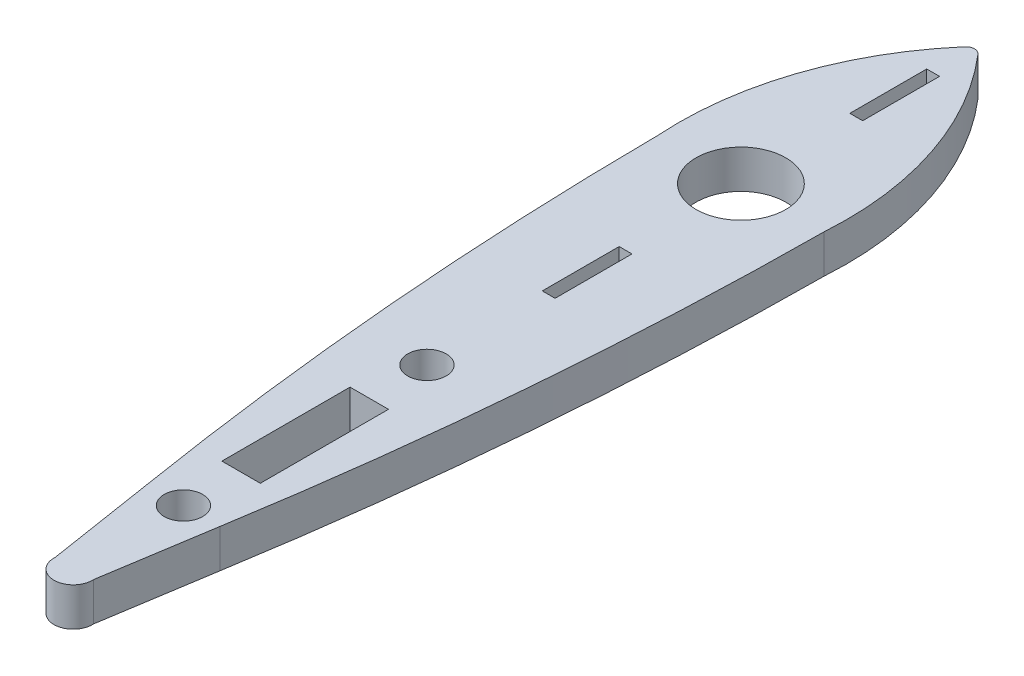
ISO-10303-21;
HEADER;
FILE_DESCRIPTION(('STEP AP214'),'2;1');
FILE_NAME('part.step','',(''),(''),'','','');
FILE_SCHEMA(('AUTOMOTIVE_DESIGN { 1 0 10303 214 1 1 1 1 }'));
ENDSEC;
DATA;
#1=APPLICATION_CONTEXT('core data for automotive mechanical design processes');
#2=APPLICATION_PROTOCOL_DEFINITION('international standard','automotive_design',2000,#1);
#3=PRODUCT_CONTEXT('',#1,'mechanical');
#4=PRODUCT('Part','Part','',(#3));
#5=PRODUCT_RELATED_PRODUCT_CATEGORY('part','',(#4));
#6=PRODUCT_DEFINITION_FORMATION('','',#4);
#7=PRODUCT_DEFINITION_CONTEXT('part definition',#1,'design');
#8=PRODUCT_DEFINITION('design','',#6,#7);
#9=PRODUCT_DEFINITION_SHAPE('','',#8);
#10=(LENGTH_UNIT() NAMED_UNIT(*) SI_UNIT(.MILLI.,.METRE.));
#11=(NAMED_UNIT(*) PLANE_ANGLE_UNIT() SI_UNIT($,.RADIAN.));
#12=(NAMED_UNIT(*) SI_UNIT($,.STERADIAN.) SOLID_ANGLE_UNIT());
#13=UNCERTAINTY_MEASURE_WITH_UNIT(LENGTH_MEASURE(1.E-05),#10,'distance_accuracy_value','');
#14=(GEOMETRIC_REPRESENTATION_CONTEXT(3) GLOBAL_UNCERTAINTY_ASSIGNED_CONTEXT((#13)) GLOBAL_UNIT_ASSIGNED_CONTEXT((#10,
#11,#12)) REPRESENTATION_CONTEXT('',''));
#15=CARTESIAN_POINT('',(0.,0.,0.));
#16=DIRECTION('',(0.,0.,1.));
#17=DIRECTION('',(1.,0.,0.));
#18=AXIS2_PLACEMENT_3D('',#15,#16,#17);
#19=CARTESIAN_POINT('',(275.41775236671,3.,-1.94905536330217));
#20=DIRECTION('',(0.,-1.,0.));
#21=DIRECTION('',(0.,0.,-1.));
#22=AXIS2_PLACEMENT_3D('',#19,#20,#21);
#23=PLANE('',#22);
#24=CARTESIAN_POINT('',(-0.0431181659658649,3.,24.377133974683));
#25=DIRECTION('',(0.,1.,0.));
#26=DIRECTION('',(0.,0.,1.));
#27=AXIS2_PLACEMENT_3D('',#24,#25,#26);
#28=CIRCLE('',#27,1.5);
#29=CARTESIAN_POINT('',(-0.0431181659658649,3.,25.877133974683));
#30=VERTEX_POINT('',#29);
#31=EDGE_CURVE('E206',#30,#30,#28,.T.);
#32=ORIENTED_EDGE('',*,*,#31,.F.);
#33=EDGE_LOOP('',(#32));
#34=FACE_BOUND('',#33,.T.);
#35=CARTESIAN_POINT('',(-0.043118165965858,3.,43.377133974683));
#36=DIRECTION('',(0.,1.,0.));
#37=DIRECTION('',(0.,0.,1.));
#38=AXIS2_PLACEMENT_3D('',#35,#36,#37);
#39=CIRCLE('',#38,1.5);
#40=CARTESIAN_POINT('',(-0.043118165965858,3.,44.877133974683));
#41=VERTEX_POINT('',#40);
#42=EDGE_CURVE('E212',#41,#41,#39,.T.);
#43=ORIENTED_EDGE('',*,*,#42,.F.);
#44=EDGE_LOOP('',(#43));
#45=FACE_BOUND('',#44,.T.);
#46=DIRECTION('',(0.,0.,-1.));
#47=VECTOR('',#46,1.);
#48=CARTESIAN_POINT('',(0.456881834034132,3.,-9.12286602531705));
#49=LINE('',#48,#47);
#50=CARTESIAN_POINT('',(0.456881834034132,3.,-9.12286602531705));
#51=VERTEX_POINT('',#50);
#52=CARTESIAN_POINT('',(0.456881834034132,3.,-15.122866025317));
#53=VERTEX_POINT('',#52);
#54=EDGE_CURVE('E218',#51,#53,#49,.T.);
#55=ORIENTED_EDGE('',*,*,#54,.F.);
#56=DIRECTION('',(1.,0.,0.));
#57=VECTOR('',#56,1.);
#58=CARTESIAN_POINT('',(-0.543118165965867,3.,-9.12286602531705));
#59=LINE('',#58,#57);
#60=CARTESIAN_POINT('',(-0.543118165965917,3.,-9.12286602531705));
#61=VERTEX_POINT('',#60);
#62=EDGE_CURVE('E226',#61,#51,#59,.T.);
#63=ORIENTED_EDGE('',*,*,#62,.F.);
#64=DIRECTION('',(0.,0.,1.));
#65=VECTOR('',#64,1.);
#66=CARTESIAN_POINT('',(-0.543118165965867,3.,-15.122866025317));
#67=LINE('',#66,#65);
#68=CARTESIAN_POINT('',(-0.543118165965867,3.,-15.122866025317));
#69=VERTEX_POINT('',#68);
#70=EDGE_CURVE('E223',#69,#61,#67,.T.);
#71=ORIENTED_EDGE('',*,*,#70,.F.);
#72=DIRECTION('',(-1.,0.,0.));
#73=VECTOR('',#72,1.);
#74=CARTESIAN_POINT('',(0.456881834034132,3.,-15.122866025317));
#75=LINE('',#74,#73);
#76=EDGE_CURVE('E220',#53,#69,#75,.T.);
#77=ORIENTED_EDGE('',*,*,#76,.F.);
#78=EDGE_LOOP('',(#55,#63,#71,#77));
#79=FACE_BOUND('',#78,.T.);
#80=CARTESIAN_POINT('',(-0.0431181659658678,3.,-0.122866025317046));
#81=DIRECTION('',(0.,1.,0.));
#82=DIRECTION('',(0.,0.,1.));
#83=AXIS2_PLACEMENT_3D('',#80,#81,#82);
#84=CIRCLE('',#83,3.5);
#85=CARTESIAN_POINT('',(-0.0431181659658678,3.,3.37713397468295));
#86=VERTEX_POINT('',#85);
#87=EDGE_CURVE('E281',#86,#86,#84,.T.);
#88=ORIENTED_EDGE('',*,*,#87,.F.);
#89=EDGE_LOOP('',(#88));
#90=FACE_BOUND('',#89,.T.);
#91=CARTESIAN_POINT('',(275.41775236671,3.,-1.94905536330217));
#92=DIRECTION('',(0.,1.,0.));
#93=DIRECTION('',(0.,0.,-1.));
#94=AXIS2_PLACEMENT_3D('',#91,#92,#93);
#95=CIRCLE('',#94,281.96678435419);
#96=CARTESIAN_POINT('',(-6.54311816596587,3.,-0.122866025317048));
#97=VERTEX_POINT('',#96);
#98=CARTESIAN_POINT('',(-2.88209319404319,3.,43.3771339746829));
#99=VERTEX_POINT('',#98);
#100=EDGE_CURVE('E287',#97,#99,#95,.T.);
#101=ORIENTED_EDGE('',*,*,#100,.T.);
#102=DIRECTION('',(0.155607634918458,0.,0.987818942901524));
#103=VECTOR('',#102,1.);
#104=CARTESIAN_POINT('',(-1.54311816596586,3.,51.877133974683));
#105=LINE('',#104,#103);
#106=CARTESIAN_POINT('',(-1.54311816596586,3.,51.877133974683));
#107=VERTEX_POINT('',#106);
#108=EDGE_CURVE('E290',#99,#107,#105,.T.);
#109=ORIENTED_EDGE('',*,*,#108,.T.);
#110=CARTESIAN_POINT('',(-0.043118165965858,3.,51.9758627499524));
#111=DIRECTION('',(0.,1.,0.));
#112=DIRECTION('',(0.,0.,1.));
#113=AXIS2_PLACEMENT_3D('',#110,#111,#112);
#114=CIRCLE('',#113,1.50324561235554);
#115=CARTESIAN_POINT('',(1.45688183403414,3.,51.877133974683));
#116=VERTEX_POINT('',#115);
#117=EDGE_CURVE('E293',#107,#116,#114,.T.);
#118=ORIENTED_EDGE('',*,*,#117,.T.);
#119=DIRECTION('',(0.155607634918589,0.,-0.987818942901503));
#120=VECTOR('',#119,1.);
#121=CARTESIAN_POINT('',(1.45688183403414,3.,51.877133974683));
#122=LINE('',#121,#120);
#123=CARTESIAN_POINT('',(2.79585686211259,3.,43.3771339746829));
#124=VERTEX_POINT('',#123);
#125=EDGE_CURVE('E295',#116,#124,#122,.T.);
#126=ORIENTED_EDGE('',*,*,#125,.T.);
#127=CARTESIAN_POINT('',(-275.503988698641,3.,-1.94905536330217));
#128=DIRECTION('',(0.,1.,0.));
#129=DIRECTION('',(0.,0.,1.));
#130=AXIS2_PLACEMENT_3D('',#127,#128,#129);
#131=CIRCLE('',#130,281.96678435419);
#132=CARTESIAN_POINT('',(6.45688183403413,3.,-0.122866025317046));
#133=VERTEX_POINT('',#132);
#134=EDGE_CURVE('E297',#124,#133,#131,.T.);
#135=ORIENTED_EDGE('',*,*,#134,.T.);
#136=CARTESIAN_POINT('',(-18.416155285819,3.,-1.83185365203266));
#137=DIRECTION('',(0.,1.,0.));
#138=DIRECTION('',(0.,0.,1.));
#139=AXIS2_PLACEMENT_3D('',#136,#137,#138);
#140=CIRCLE('',#139,24.9316789301054);
#141=CARTESIAN_POINT('',(0.456881834034132,3.,-18.122866025317));
#142=VERTEX_POINT('',#141);
#143=EDGE_CURVE('E299',#133,#142,#140,.T.);
#144=ORIENTED_EDGE('',*,*,#143,.T.);
#145=CARTESIAN_POINT('',(-0.0431181659658678,3.,-17.6743779736352));
#146=DIRECTION('',(0.,1.,0.));
#147=DIRECTION('',(0.,0.,-1.));
#148=AXIS2_PLACEMENT_3D('',#145,#146,#147);
#149=CIRCLE('',#148,0.671670702428921);
#150=CARTESIAN_POINT('',(-0.543118165965875,3.,-18.122866025317));
#151=VERTEX_POINT('',#150);
#152=EDGE_CURVE('E301',#142,#151,#149,.T.);
#153=ORIENTED_EDGE('',*,*,#152,.T.);
#154=CARTESIAN_POINT('',(18.3299189538873,3.,-1.83185365203266));
#155=DIRECTION('',(0.,1.,0.));
#156=DIRECTION('',(0.,0.,-1.));
#157=AXIS2_PLACEMENT_3D('',#154,#155,#156);
#158=CIRCLE('',#157,24.9316789301054);
#159=EDGE_CURVE('E303',#151,#97,#158,.T.);
#160=ORIENTED_EDGE('',*,*,#159,.T.);
#161=EDGE_LOOP('',(#101,#109,#118,#126,#135,#144,#153,#160));
#162=FACE_BOUND('',#161,.T.);
#163=DIRECTION('',(-1.,0.,0.));
#164=VECTOR('',#163,1.);
#165=CARTESIAN_POINT('',(-0.543118165965867,3.,8.87713397468295));
#166=LINE('',#165,#164);
#167=CARTESIAN_POINT('',(0.456881834034132,3.,8.87713397468295));
#168=VERTEX_POINT('',#167);
#169=CARTESIAN_POINT('',(-0.543118165965867,3.,8.87713397468295));
#170=VERTEX_POINT('',#169);
#171=EDGE_CURVE('E249',#168,#170,#166,.T.);
#172=ORIENTED_EDGE('',*,*,#171,.F.);
#173=DIRECTION('',(0.,0.,-1.));
#174=VECTOR('',#173,1.);
#175=CARTESIAN_POINT('',(0.456881834034132,3.,8.87713397468295));
#176=LINE('',#175,#174);
#177=CARTESIAN_POINT('',(0.45688183403414,3.,14.877133974683));
#178=VERTEX_POINT('',#177);
#179=EDGE_CURVE('E257',#178,#168,#176,.T.);
#180=ORIENTED_EDGE('',*,*,#179,.F.);
#181=DIRECTION('',(1.,0.,0.));
#182=VECTOR('',#181,1.);
#183=CARTESIAN_POINT('',(-0.0431181659658659,3.,14.877133974683));
#184=LINE('',#183,#182);
#185=CARTESIAN_POINT('',(-0.543118165965867,3.,14.877133974683));
#186=VERTEX_POINT('',#185);
#187=EDGE_CURVE('E254',#186,#178,#184,.T.);
#188=ORIENTED_EDGE('',*,*,#187,.F.);
#189=DIRECTION('',(0.,0.,1.));
#190=VECTOR('',#189,1.);
#191=CARTESIAN_POINT('',(-0.543118165965867,3.,14.877133974683));
#192=LINE('',#191,#190);
#193=EDGE_CURVE('E251',#170,#186,#192,.T.);
#194=ORIENTED_EDGE('',*,*,#193,.F.);
#195=EDGE_LOOP('',(#172,#180,#188,#194));
#196=FACE_BOUND('',#195,.T.);
#197=DIRECTION('',(1.,0.,0.));
#198=VECTOR('',#197,1.);
#199=CARTESIAN_POINT('',(-1.54311816596586,3.,38.877133974683));
#200=LINE('',#199,#198);
#201=CARTESIAN_POINT('',(-1.54311816596586,3.,38.877133974683));
#202=VERTEX_POINT('',#201);
#203=CARTESIAN_POINT('',(1.45688183403414,3.,38.877133974683));
#204=VERTEX_POINT('',#203);
#205=EDGE_CURVE('E167',#202,#204,#200,.T.);
#206=ORIENTED_EDGE('',*,*,#205,.F.);
#207=DIRECTION('',(0.,0.,1.));
#208=VECTOR('',#207,1.);
#209=CARTESIAN_POINT('',(-1.54311816596586,3.,28.877133974683));
#210=LINE('',#209,#208);
#211=CARTESIAN_POINT('',(-1.54311816596586,3.,28.877133974683));
#212=VERTEX_POINT('',#211);
#213=EDGE_CURVE('E191',#212,#202,#210,.T.);
#214=ORIENTED_EDGE('',*,*,#213,.F.);
#215=DIRECTION('',(-1.,0.,0.));
#216=VECTOR('',#215,1.);
#217=CARTESIAN_POINT('',(-0.043118165965858,3.,28.877133974683));
#218=LINE('',#217,#216);
#219=CARTESIAN_POINT('',(1.45688183403414,3.,28.877133974683));
#220=VERTEX_POINT('',#219);
#221=EDGE_CURVE('E189',#220,#212,#218,.T.);
#222=ORIENTED_EDGE('',*,*,#221,.F.);
#223=DIRECTION('',(0.,0.,-1.));
#224=VECTOR('',#223,1.);
#225=CARTESIAN_POINT('',(1.45688183403414,3.,28.877133974683));
#226=LINE('',#225,#224);
#227=EDGE_CURVE('E175',#204,#220,#226,.T.);
#228=ORIENTED_EDGE('',*,*,#227,.F.);
#229=EDGE_LOOP('',(#206,#214,#222,#228));
#230=FACE_BOUND('',#229,.T.);
#231=ADVANCED_FACE('F32',(#34,#45,#79,#90,#162,#196,#230),#23,.F.);
#232=CARTESIAN_POINT('',(275.41775236671,0.,-1.94905536330217));
#233=DIRECTION('',(0.,-1.,0.));
#234=DIRECTION('',(0.,0.,-1.));
#235=AXIS2_PLACEMENT_3D('',#232,#233,#234);
#236=PLANE('',#235);
#237=CARTESIAN_POINT('',(-0.043118165965858,0.,43.377133974683));
#238=DIRECTION('',(0.,1.,0.));
#239=DIRECTION('',(0.,0.,1.));
#240=AXIS2_PLACEMENT_3D('',#237,#238,#239);
#241=CIRCLE('',#240,1.5);
#242=CARTESIAN_POINT('',(-0.043118165965858,0.,44.877133974683));
#243=VERTEX_POINT('',#242);
#244=EDGE_CURVE('E209',#243,#243,#241,.T.);
#245=ORIENTED_EDGE('',*,*,#244,.T.);
#246=EDGE_LOOP('',(#245));
#247=FACE_BOUND('',#246,.T.);
#248=CARTESIAN_POINT('',(275.41775236671,0.,-1.94905536330217));
#249=DIRECTION('',(0.,1.,0.));
#250=DIRECTION('',(0.,0.,-1.));
#251=AXIS2_PLACEMENT_3D('',#248,#249,#250);
#252=CIRCLE('',#251,281.96678435419);
#253=CARTESIAN_POINT('',(-6.54311816596587,0.,-0.122866025317048));
#254=VERTEX_POINT('',#253);
#255=CARTESIAN_POINT('',(-2.88209319404319,0.,43.3771339746829));
#256=VERTEX_POINT('',#255);
#257=EDGE_CURVE('E284',#254,#256,#252,.T.);
#258=ORIENTED_EDGE('',*,*,#257,.F.);
#259=CARTESIAN_POINT('',(18.3299189538873,0.,-1.83185365203266));
#260=DIRECTION('',(0.,1.,0.));
#261=DIRECTION('',(0.,0.,-1.));
#262=AXIS2_PLACEMENT_3D('',#259,#260,#261);
#263=CIRCLE('',#262,24.9316789301054);
#264=CARTESIAN_POINT('',(-0.543118165965875,0.,-18.122866025317));
#265=VERTEX_POINT('',#264);
#266=EDGE_CURVE('E291',#265,#254,#263,.T.);
#267=ORIENTED_EDGE('',*,*,#266,.F.);
#268=CARTESIAN_POINT('',(-0.0431181659658678,0.,-17.6743779736352));
#269=DIRECTION('',(0.,1.,0.));
#270=DIRECTION('',(0.,0.,-1.));
#271=AXIS2_PLACEMENT_3D('',#268,#269,#270);
#272=CIRCLE('',#271,0.671670702428921);
#273=CARTESIAN_POINT('',(0.456881834034132,0.,-18.122866025317));
#274=VERTEX_POINT('',#273);
#275=EDGE_CURVE('E318',#274,#265,#272,.T.);
#276=ORIENTED_EDGE('',*,*,#275,.F.);
#277=CARTESIAN_POINT('',(-18.416155285819,0.,-1.83185365203266));
#278=DIRECTION('',(0.,1.,0.));
#279=DIRECTION('',(0.,0.,1.));
#280=AXIS2_PLACEMENT_3D('',#277,#278,#279);
#281=CIRCLE('',#280,24.9316789301054);
#282=CARTESIAN_POINT('',(6.45688183403413,0.,-0.122866025317046));
#283=VERTEX_POINT('',#282);
#284=EDGE_CURVE('E316',#283,#274,#281,.T.);
#285=ORIENTED_EDGE('',*,*,#284,.F.);
#286=CARTESIAN_POINT('',(-275.503988698641,0.,-1.94905536330217));
#287=DIRECTION('',(0.,1.,0.));
#288=DIRECTION('',(0.,0.,1.));
#289=AXIS2_PLACEMENT_3D('',#286,#287,#288);
#290=CIRCLE('',#289,281.96678435419);
#291=CARTESIAN_POINT('',(2.79585686211259,0.,43.3771339746829));
#292=VERTEX_POINT('',#291);
#293=EDGE_CURVE('E314',#292,#283,#290,.T.);
#294=ORIENTED_EDGE('',*,*,#293,.F.);
#295=DIRECTION('',(0.155607634918589,0.,-0.987818942901503));
#296=VECTOR('',#295,1.);
#297=CARTESIAN_POINT('',(1.45688183403414,0.,51.877133974683));
#298=LINE('',#297,#296);
#299=CARTESIAN_POINT('',(1.45688183403414,0.,51.877133974683));
#300=VERTEX_POINT('',#299);
#301=EDGE_CURVE('E312',#300,#292,#298,.T.);
#302=ORIENTED_EDGE('',*,*,#301,.F.);
#303=CARTESIAN_POINT('',(-0.043118165965858,0.,51.9758627499524));
#304=DIRECTION('',(0.,1.,0.));
#305=DIRECTION('',(0.,0.,1.));
#306=AXIS2_PLACEMENT_3D('',#303,#304,#305);
#307=CIRCLE('',#306,1.50324561235554);
#308=CARTESIAN_POINT('',(-1.54311816596586,0.,51.877133974683));
#309=VERTEX_POINT('',#308);
#310=EDGE_CURVE('E310',#309,#300,#307,.T.);
#311=ORIENTED_EDGE('',*,*,#310,.F.);
#312=DIRECTION('',(0.155607634918458,0.,0.987818942901524));
#313=VECTOR('',#312,1.);
#314=CARTESIAN_POINT('',(-1.54311816596586,0.,51.877133974683));
#315=LINE('',#314,#313);
#316=EDGE_CURVE('E308',#256,#309,#315,.T.);
#317=ORIENTED_EDGE('',*,*,#316,.F.);
#318=EDGE_LOOP('',(#258,#267,#276,#285,#294,#302,#311,#317));
#319=FACE_BOUND('',#318,.T.);
#320=CARTESIAN_POINT('',(-0.0431181659658678,0.,-0.122866025317046));
#321=DIRECTION('',(0.,1.,0.));
#322=DIRECTION('',(0.,0.,1.));
#323=AXIS2_PLACEMENT_3D('',#320,#321,#322);
#324=CIRCLE('',#323,3.5);
#325=CARTESIAN_POINT('',(-0.0431181659658678,0.,3.37713397468295));
#326=VERTEX_POINT('',#325);
#327=EDGE_CURVE('E280',#326,#326,#324,.T.);
#328=ORIENTED_EDGE('',*,*,#327,.T.);
#329=EDGE_LOOP('',(#328));
#330=FACE_BOUND('',#329,.T.);
#331=DIRECTION('',(0.,0.,-1.));
#332=VECTOR('',#331,1.);
#333=CARTESIAN_POINT('',(0.456881834034132,0.,8.87713397468295));
#334=LINE('',#333,#332);
#335=CARTESIAN_POINT('',(0.456881834034132,0.,14.877133974683));
#336=VERTEX_POINT('',#335);
#337=CARTESIAN_POINT('',(0.45688183403414,0.,8.87713397468295));
#338=VERTEX_POINT('',#337);
#339=EDGE_CURVE('E252',#336,#338,#334,.T.);
#340=ORIENTED_EDGE('',*,*,#339,.T.);
#341=DIRECTION('',(-1.,0.,0.));
#342=VECTOR('',#341,1.);
#343=CARTESIAN_POINT('',(-0.543118165965867,0.,8.87713397468295));
#344=LINE('',#343,#342);
#345=CARTESIAN_POINT('',(-0.543118165965867,0.,8.87713397468295));
#346=VERTEX_POINT('',#345);
#347=EDGE_CURVE('E248',#338,#346,#344,.T.);
#348=ORIENTED_EDGE('',*,*,#347,.T.);
#349=DIRECTION('',(0.,0.,1.));
#350=VECTOR('',#349,1.);
#351=CARTESIAN_POINT('',(-0.543118165965867,0.,14.877133974683));
#352=LINE('',#351,#350);
#353=CARTESIAN_POINT('',(-0.543118165965867,0.,14.877133974683));
#354=VERTEX_POINT('',#353);
#355=EDGE_CURVE('E262',#346,#354,#352,.T.);
#356=ORIENTED_EDGE('',*,*,#355,.T.);
#357=DIRECTION('',(1.,0.,0.));
#358=VECTOR('',#357,1.);
#359=CARTESIAN_POINT('',(0.456881834034132,0.,14.877133974683));
#360=LINE('',#359,#358);
#361=EDGE_CURVE('E265',#354,#336,#360,.T.);
#362=ORIENTED_EDGE('',*,*,#361,.T.);
#363=EDGE_LOOP('',(#340,#348,#356,#362));
#364=FACE_BOUND('',#363,.T.);
#365=DIRECTION('',(1.,0.,0.));
#366=VECTOR('',#365,1.);
#367=CARTESIAN_POINT('',(-0.543118165965867,0.,-9.12286602531705));
#368=LINE('',#367,#366);
#369=CARTESIAN_POINT('',(-0.543118165965867,0.,-9.12286602531705));
#370=VERTEX_POINT('',#369);
#371=CARTESIAN_POINT('',(0.45688183403414,0.,-9.12286602531705));
#372=VERTEX_POINT('',#371);
#373=EDGE_CURVE('E221',#370,#372,#368,.T.);
#374=ORIENTED_EDGE('',*,*,#373,.T.);
#375=DIRECTION('',(0.,0.,-1.));
#376=VECTOR('',#375,1.);
#377=CARTESIAN_POINT('',(0.456881834034132,0.,-9.12286602531705));
#378=LINE('',#377,#376);
#379=CARTESIAN_POINT('',(0.456881834034132,0.,-15.122866025317));
#380=VERTEX_POINT('',#379);
#381=EDGE_CURVE('E215',#372,#380,#378,.T.);
#382=ORIENTED_EDGE('',*,*,#381,.T.);
#383=DIRECTION('',(-1.,0.,0.));
#384=VECTOR('',#383,1.);
#385=CARTESIAN_POINT('',(-0.0431181659658659,0.,-15.122866025317));
#386=LINE('',#385,#384);
#387=CARTESIAN_POINT('',(-0.543118165965867,0.,-15.122866025317));
#388=VERTEX_POINT('',#387);
#389=EDGE_CURVE('E231',#380,#388,#386,.T.);
#390=ORIENTED_EDGE('',*,*,#389,.T.);
#391=DIRECTION('',(0.,0.,1.));
#392=VECTOR('',#391,1.);
#393=CARTESIAN_POINT('',(-0.543118165965867,0.,-15.122866025317));
#394=LINE('',#393,#392);
#395=EDGE_CURVE('E234',#388,#370,#394,.T.);
#396=ORIENTED_EDGE('',*,*,#395,.T.);
#397=EDGE_LOOP('',(#374,#382,#390,#396));
#398=FACE_BOUND('',#397,.T.);
#399=CARTESIAN_POINT('',(-0.0431181659658649,0.,24.377133974683));
#400=DIRECTION('',(0.,1.,0.));
#401=DIRECTION('',(0.,0.,1.));
#402=AXIS2_PLACEMENT_3D('',#399,#400,#401);
#403=CIRCLE('',#402,1.5);
#404=CARTESIAN_POINT('',(-0.0431181659658649,0.,25.877133974683));
#405=VERTEX_POINT('',#404);
#406=EDGE_CURVE('E185',#405,#405,#403,.T.);
#407=ORIENTED_EDGE('',*,*,#406,.T.);
#408=EDGE_LOOP('',(#407));
#409=FACE_BOUND('',#408,.T.);
#410=DIRECTION('',(0.,0.,1.));
#411=VECTOR('',#410,1.);
#412=CARTESIAN_POINT('',(-1.54311816596586,0.,28.877133974683));
#413=LINE('',#412,#411);
#414=CARTESIAN_POINT('',(-1.54311816596586,0.,28.877133974683));
#415=VERTEX_POINT('',#414);
#416=CARTESIAN_POINT('',(-1.54311816596586,0.,38.877133974683));
#417=VERTEX_POINT('',#416);
#418=EDGE_CURVE('E176',#415,#417,#413,.T.);
#419=ORIENTED_EDGE('',*,*,#418,.T.);
#420=DIRECTION('',(1.,0.,0.));
#421=VECTOR('',#420,1.);
#422=CARTESIAN_POINT('',(1.45688183403414,0.,38.877133974683));
#423=LINE('',#422,#421);
#424=CARTESIAN_POINT('',(1.45688183403414,0.,38.877133974683));
#425=VERTEX_POINT('',#424);
#426=EDGE_CURVE('E195',#417,#425,#423,.T.);
#427=ORIENTED_EDGE('',*,*,#426,.T.);
#428=DIRECTION('',(0.,0.,-1.));
#429=VECTOR('',#428,1.);
#430=CARTESIAN_POINT('',(1.45688183403414,0.,28.877133974683));
#431=LINE('',#430,#429);
#432=CARTESIAN_POINT('',(1.45688183403414,0.,28.877133974683));
#433=VERTEX_POINT('',#432);
#434=EDGE_CURVE('E183',#425,#433,#431,.T.);
#435=ORIENTED_EDGE('',*,*,#434,.T.);
#436=DIRECTION('',(-1.,0.,0.));
#437=VECTOR('',#436,1.);
#438=CARTESIAN_POINT('',(-0.043118165965858,0.,28.877133974683));
#439=LINE('',#438,#437);
#440=EDGE_CURVE('E198',#433,#415,#439,.T.);
#441=ORIENTED_EDGE('',*,*,#440,.T.);
#442=EDGE_LOOP('',(#419,#427,#435,#441));
#443=FACE_BOUND('',#442,.T.);
#444=ADVANCED_FACE('F348',(#247,#319,#330,#364,#398,#409,#443),#236,.T.);
#445=CARTESIAN_POINT('',(275.41775236671,3.,-1.94905536330217));
#446=DIRECTION('',(0.,-1.,0.));
#447=DIRECTION('',(0.,0.,-1.));
#448=AXIS2_PLACEMENT_3D('',#445,#446,#447);
#449=CYLINDRICAL_SURFACE('',#448,281.96678435419);
#450=ORIENTED_EDGE('',*,*,#257,.T.);
#451=DIRECTION('',(0.,-1.,0.));
#452=VECTOR('',#451,1.);
#453=CARTESIAN_POINT('',(-2.88209319404319,3.,43.3771339746829));
#454=LINE('',#453,#452);
#455=EDGE_CURVE('E11',#99,#256,#454,.T.);
#456=ORIENTED_EDGE('',*,*,#455,.F.);
#457=ORIENTED_EDGE('',*,*,#100,.F.);
#458=DIRECTION('',(0.,-1.,0.));
#459=VECTOR('',#458,1.);
#460=CARTESIAN_POINT('',(-6.54311816596587,3.,-0.122866025317048));
#461=LINE('',#460,#459);
#462=EDGE_CURVE('E305',#97,#254,#461,.T.);
#463=ORIENTED_EDGE('',*,*,#462,.T.);
#464=EDGE_LOOP('',(#450,#456,#457,#463));
#465=FACE_BOUND('',#464,.T.);
#466=ADVANCED_FACE('F34',(#465),#449,.T.);
#467=CARTESIAN_POINT('',(-1.54311816596586,3.,51.877133974683));
#468=DIRECTION('',(0.987818942901524,0.,-0.155607634918458));
#469=DIRECTION('',(-0.155607634918458,0.,-0.987818942901524));
#470=AXIS2_PLACEMENT_3D('',#467,#468,#469);
#471=PLANE('',#470);
#472=ORIENTED_EDGE('',*,*,#316,.T.);
#473=DIRECTION('',(0.,-1.,0.));
#474=VECTOR('',#473,1.);
#475=CARTESIAN_POINT('',(-1.54311816596586,3.,51.877133974683));
#476=LINE('',#475,#474);
#477=EDGE_CURVE('E40',#107,#309,#476,.T.);
#478=ORIENTED_EDGE('',*,*,#477,.F.);
#479=ORIENTED_EDGE('',*,*,#108,.F.);
#480=ORIENTED_EDGE('',*,*,#455,.T.);
#481=EDGE_LOOP('',(#472,#478,#479,#480));
#482=FACE_BOUND('',#481,.T.);
#483=ADVANCED_FACE('F366',(#482),#471,.F.);
#484=CARTESIAN_POINT('',(-0.043118165965858,3.,51.9758627499524));
#485=DIRECTION('',(0.,-1.,0.));
#486=DIRECTION('',(0.,0.,-1.));
#487=AXIS2_PLACEMENT_3D('',#484,#485,#486);
#488=CYLINDRICAL_SURFACE('',#487,1.50324561235554);
#489=ORIENTED_EDGE('',*,*,#310,.T.);
#490=DIRECTION('',(0.,-1.,0.));
#491=VECTOR('',#490,1.);
#492=CARTESIAN_POINT('',(1.45688183403414,3.,51.877133974683));
#493=LINE('',#492,#491);
#494=EDGE_CURVE('E335',#116,#300,#493,.T.);
#495=ORIENTED_EDGE('',*,*,#494,.F.);
#496=ORIENTED_EDGE('',*,*,#117,.F.);
#497=ORIENTED_EDGE('',*,*,#477,.T.);
#498=EDGE_LOOP('',(#489,#495,#496,#497));
#499=FACE_BOUND('',#498,.T.);
#500=ADVANCED_FACE('F342',(#499),#488,.T.);
#501=CARTESIAN_POINT('',(1.45688183403414,3.,51.877133974683));
#502=DIRECTION('',(-0.987818942901503,0.,-0.155607634918589));
#503=DIRECTION('',(-0.155607634918589,0.,0.987818942901503));
#504=AXIS2_PLACEMENT_3D('',#501,#502,#503);
#505=PLANE('',#504);
#506=ORIENTED_EDGE('',*,*,#301,.T.);
#507=DIRECTION('',(0.,-1.,0.));
#508=VECTOR('',#507,1.);
#509=CARTESIAN_POINT('',(2.79585686211259,3.,43.3771339746829));
#510=LINE('',#509,#508);
#511=EDGE_CURVE('E332',#124,#292,#510,.T.);
#512=ORIENTED_EDGE('',*,*,#511,.F.);
#513=ORIENTED_EDGE('',*,*,#125,.F.);
#514=ORIENTED_EDGE('',*,*,#494,.T.);
#515=EDGE_LOOP('',(#506,#512,#513,#514));
#516=FACE_BOUND('',#515,.T.);
#517=ADVANCED_FACE('F354',(#516),#505,.F.);
#518=CARTESIAN_POINT('',(-275.503988698641,3.,-1.94905536330217));
#519=DIRECTION('',(0.,-1.,0.));
#520=DIRECTION('',(0.,0.,-1.));
#521=AXIS2_PLACEMENT_3D('',#518,#519,#520);
#522=CYLINDRICAL_SURFACE('',#521,281.96678435419);
#523=ORIENTED_EDGE('',*,*,#293,.T.);
#524=DIRECTION('',(0.,-1.,0.));
#525=VECTOR('',#524,1.);
#526=CARTESIAN_POINT('',(6.45688183403413,3.,-0.122866025317046));
#527=LINE('',#526,#525);
#528=EDGE_CURVE('E329',#133,#283,#527,.T.);
#529=ORIENTED_EDGE('',*,*,#528,.F.);
#530=ORIENTED_EDGE('',*,*,#134,.F.);
#531=ORIENTED_EDGE('',*,*,#511,.T.);
#532=EDGE_LOOP('',(#523,#529,#530,#531));
#533=FACE_BOUND('',#532,.T.);
#534=ADVANCED_FACE('F358',(#533),#522,.T.);
#535=CARTESIAN_POINT('',(-18.416155285819,3.,-1.83185365203266));
#536=DIRECTION('',(0.,-1.,0.));
#537=DIRECTION('',(0.,0.,-1.));
#538=AXIS2_PLACEMENT_3D('',#535,#536,#537);
#539=CYLINDRICAL_SURFACE('',#538,24.9316789301054);
#540=ORIENTED_EDGE('',*,*,#284,.T.);
#541=DIRECTION('',(0.,-1.,0.));
#542=VECTOR('',#541,1.);
#543=CARTESIAN_POINT('',(0.456881834034132,3.,-18.122866025317));
#544=LINE('',#543,#542);
#545=EDGE_CURVE('E326',#142,#274,#544,.T.);
#546=ORIENTED_EDGE('',*,*,#545,.F.);
#547=ORIENTED_EDGE('',*,*,#143,.F.);
#548=ORIENTED_EDGE('',*,*,#528,.T.);
#549=EDGE_LOOP('',(#540,#546,#547,#548));
#550=FACE_BOUND('',#549,.T.);
#551=ADVANCED_FACE('F379',(#550),#539,.T.);
#552=CARTESIAN_POINT('',(-0.0431181659658678,3.,-17.6743779736352));
#553=DIRECTION('',(0.,-1.,0.));
#554=DIRECTION('',(0.,0.,-1.));
#555=AXIS2_PLACEMENT_3D('',#552,#553,#554);
#556=CYLINDRICAL_SURFACE('',#555,0.671670702428921);
#557=ORIENTED_EDGE('',*,*,#275,.T.);
#558=DIRECTION('',(0.,-1.,0.));
#559=VECTOR('',#558,1.);
#560=CARTESIAN_POINT('',(-0.543118165965875,3.,-18.122866025317));
#561=LINE('',#560,#559);
#562=EDGE_CURVE('E323',#151,#265,#561,.T.);
#563=ORIENTED_EDGE('',*,*,#562,.F.);
#564=ORIENTED_EDGE('',*,*,#152,.F.);
#565=ORIENTED_EDGE('',*,*,#545,.T.);
#566=EDGE_LOOP('',(#557,#563,#564,#565));
#567=FACE_BOUND('',#566,.T.);
#568=ADVANCED_FACE('F377',(#567),#556,.T.);
#569=CARTESIAN_POINT('',(18.3299189538873,3.,-1.83185365203266));
#570=DIRECTION('',(0.,-1.,0.));
#571=DIRECTION('',(0.,0.,-1.));
#572=AXIS2_PLACEMENT_3D('',#569,#570,#571);
#573=CYLINDRICAL_SURFACE('',#572,24.9316789301054);
#574=ORIENTED_EDGE('',*,*,#266,.T.);
#575=ORIENTED_EDGE('',*,*,#462,.F.);
#576=ORIENTED_EDGE('',*,*,#159,.F.);
#577=ORIENTED_EDGE('',*,*,#562,.T.);
#578=EDGE_LOOP('',(#574,#575,#576,#577));
#579=FACE_BOUND('',#578,.T.);
#580=ADVANCED_FACE('F372',(#579),#573,.T.);
#581=CARTESIAN_POINT('',(-0.0431181659658678,3.,-0.122866025317046));
#582=DIRECTION('',(0.,-1.,0.));
#583=DIRECTION('',(0.,0.,-1.));
#584=AXIS2_PLACEMENT_3D('',#581,#582,#583);
#585=CYLINDRICAL_SURFACE('',#584,3.5);
#586=ORIENTED_EDGE('',*,*,#87,.T.);
#587=EDGE_LOOP('',(#586));
#588=FACE_BOUND('',#587,.T.);
#589=ORIENTED_EDGE('',*,*,#327,.F.);
#590=EDGE_LOOP('',(#589));
#591=FACE_BOUND('',#590,.T.);
#592=ADVANCED_FACE('F399',(#588,#591),#585,.F.);
#593=CARTESIAN_POINT('',(-0.543118165965867,3.,8.87713397468295));
#594=DIRECTION('',(0.,0.,1.));
#595=DIRECTION('',(1.,0.,0.));
#596=AXIS2_PLACEMENT_3D('',#593,#594,#595);
#597=PLANE('',#596);
#598=ORIENTED_EDGE('',*,*,#347,.F.);
#599=DIRECTION('',(0.,-1.,0.));
#600=VECTOR('',#599,1.);
#601=CARTESIAN_POINT('',(0.456881834034132,3.,8.87713397468295));
#602=LINE('',#601,#600);
#603=EDGE_CURVE('E259',#168,#338,#602,.T.);
#604=ORIENTED_EDGE('',*,*,#603,.F.);
#605=ORIENTED_EDGE('',*,*,#171,.T.);
#606=DIRECTION('',(0.,-1.,0.));
#607=VECTOR('',#606,1.);
#608=CARTESIAN_POINT('',(-0.543118165965867,3.,8.87713397468295));
#609=LINE('',#608,#607);
#610=EDGE_CURVE('E277',#170,#346,#609,.T.);
#611=ORIENTED_EDGE('',*,*,#610,.T.);
#612=EDGE_LOOP('',(#598,#604,#605,#611));
#613=FACE_BOUND('',#612,.T.);
#614=ADVANCED_FACE('F406',(#613),#597,.T.);
#615=CARTESIAN_POINT('',(-0.543118165965867,3.,14.877133974683));
#616=DIRECTION('',(1.,0.,0.));
#617=DIRECTION('',(0.,0.,-1.));
#618=AXIS2_PLACEMENT_3D('',#615,#616,#617);
#619=PLANE('',#618);
#620=ORIENTED_EDGE('',*,*,#355,.F.);
#621=ORIENTED_EDGE('',*,*,#610,.F.);
#622=ORIENTED_EDGE('',*,*,#193,.T.);
#623=DIRECTION('',(0.,-1.,0.));
#624=VECTOR('',#623,1.);
#625=CARTESIAN_POINT('',(-0.543118165965867,3.,14.877133974683));
#626=LINE('',#625,#624);
#627=EDGE_CURVE('E274',#186,#354,#626,.T.);
#628=ORIENTED_EDGE('',*,*,#627,.T.);
#629=EDGE_LOOP('',(#620,#621,#622,#628));
#630=FACE_BOUND('',#629,.T.);
#631=ADVANCED_FACE('F411',(#630),#619,.T.);
#632=CARTESIAN_POINT('',(0.456881834034132,3.,14.877133974683));
#633=DIRECTION('',(0.,0.,-1.));
#634=DIRECTION('',(-1.,0.,0.));
#635=AXIS2_PLACEMENT_3D('',#632,#633,#634);
#636=PLANE('',#635);
#637=ORIENTED_EDGE('',*,*,#361,.F.);
#638=ORIENTED_EDGE('',*,*,#627,.F.);
#639=ORIENTED_EDGE('',*,*,#187,.T.);
#640=DIRECTION('',(0.,-1.,0.));
#641=VECTOR('',#640,1.);
#642=CARTESIAN_POINT('',(0.456881834034132,3.,14.877133974683));
#643=LINE('',#642,#641);
#644=EDGE_CURVE('E272',#178,#336,#643,.T.);
#645=ORIENTED_EDGE('',*,*,#644,.T.);
#646=EDGE_LOOP('',(#637,#638,#639,#645));
#647=FACE_BOUND('',#646,.T.);
#648=ADVANCED_FACE('F464',(#647),#636,.T.);
#649=CARTESIAN_POINT('',(0.456881834034132,3.,8.87713397468295));
#650=DIRECTION('',(-1.,0.,0.));
#651=DIRECTION('',(0.,0.,1.));
#652=AXIS2_PLACEMENT_3D('',#649,#650,#651);
#653=PLANE('',#652);
#654=ORIENTED_EDGE('',*,*,#339,.F.);
#655=ORIENTED_EDGE('',*,*,#644,.F.);
#656=ORIENTED_EDGE('',*,*,#179,.T.);
#657=ORIENTED_EDGE('',*,*,#603,.T.);
#658=EDGE_LOOP('',(#654,#655,#656,#657));
#659=FACE_BOUND('',#658,.T.);
#660=ADVANCED_FACE('F460',(#659),#653,.T.);
#661=CARTESIAN_POINT('',(0.456881834034132,3.,-9.12286602531705));
#662=DIRECTION('',(-1.,0.,0.));
#663=DIRECTION('',(0.,0.,1.));
#664=AXIS2_PLACEMENT_3D('',#661,#662,#663);
#665=PLANE('',#664);
#666=ORIENTED_EDGE('',*,*,#381,.F.);
#667=DIRECTION('',(0.,-1.,0.));
#668=VECTOR('',#667,1.);
#669=CARTESIAN_POINT('',(0.456881834034132,3.,-9.12286602531705));
#670=LINE('',#669,#668);
#671=EDGE_CURVE('E228',#51,#372,#670,.T.);
#672=ORIENTED_EDGE('',*,*,#671,.F.);
#673=ORIENTED_EDGE('',*,*,#54,.T.);
#674=DIRECTION('',(0.,-1.,0.));
#675=VECTOR('',#674,1.);
#676=CARTESIAN_POINT('',(0.456881834034132,3.,-15.122866025317));
#677=LINE('',#676,#675);
#678=EDGE_CURVE('E245',#53,#380,#677,.T.);
#679=ORIENTED_EDGE('',*,*,#678,.T.);
#680=EDGE_LOOP('',(#666,#672,#673,#679));
#681=FACE_BOUND('',#680,.T.);
#682=ADVANCED_FACE('F456',(#681),#665,.T.);
#683=CARTESIAN_POINT('',(-0.0431181659658659,3.,-15.122866025317));
#684=DIRECTION('',(0.,0.,1.));
#685=DIRECTION('',(1.,0.,0.));
#686=AXIS2_PLACEMENT_3D('',#683,#684,#685);
#687=PLANE('',#686);
#688=ORIENTED_EDGE('',*,*,#389,.F.);
#689=ORIENTED_EDGE('',*,*,#678,.F.);
#690=ORIENTED_EDGE('',*,*,#76,.T.);
#691=DIRECTION('',(0.,-1.,0.));
#692=VECTOR('',#691,1.);
#693=CARTESIAN_POINT('',(-0.543118165965867,3.,-15.122866025317));
#694=LINE('',#693,#692);
#695=EDGE_CURVE('E243',#69,#388,#694,.T.);
#696=ORIENTED_EDGE('',*,*,#695,.T.);
#697=EDGE_LOOP('',(#688,#689,#690,#696));
#698=FACE_BOUND('',#697,.T.);
#699=ADVANCED_FACE('F452',(#698),#687,.T.);
#700=CARTESIAN_POINT('',(-0.543118165965867,3.,-15.122866025317));
#701=DIRECTION('',(1.,0.,0.));
#702=DIRECTION('',(0.,0.,-1.));
#703=AXIS2_PLACEMENT_3D('',#700,#701,#702);
#704=PLANE('',#703);
#705=ORIENTED_EDGE('',*,*,#395,.F.);
#706=ORIENTED_EDGE('',*,*,#695,.F.);
#707=ORIENTED_EDGE('',*,*,#70,.T.);
#708=DIRECTION('',(0.,-1.,0.));
#709=VECTOR('',#708,1.);
#710=CARTESIAN_POINT('',(-0.543118165965867,3.,-9.12286602531705));
#711=LINE('',#710,#709);
#712=EDGE_CURVE('E241',#61,#370,#711,.T.);
#713=ORIENTED_EDGE('',*,*,#712,.T.);
#714=EDGE_LOOP('',(#705,#706,#707,#713));
#715=FACE_BOUND('',#714,.T.);
#716=ADVANCED_FACE('F448',(#715),#704,.T.);
#717=CARTESIAN_POINT('',(-0.543118165965867,3.,-9.12286602531705));
#718=DIRECTION('',(0.,0.,-1.));
#719=DIRECTION('',(-1.,0.,0.));
#720=AXIS2_PLACEMENT_3D('',#717,#718,#719);
#721=PLANE('',#720);
#722=ORIENTED_EDGE('',*,*,#373,.F.);
#723=ORIENTED_EDGE('',*,*,#712,.F.);
#724=ORIENTED_EDGE('',*,*,#62,.T.);
#725=ORIENTED_EDGE('',*,*,#671,.T.);
#726=EDGE_LOOP('',(#722,#723,#724,#725));
#727=FACE_BOUND('',#726,.T.);
#728=ADVANCED_FACE('F444',(#727),#721,.T.);
#729=CARTESIAN_POINT('',(-0.043118165965858,3.,43.377133974683));
#730=DIRECTION('',(0.,-1.,0.));
#731=DIRECTION('',(0.,0.,-1.));
#732=AXIS2_PLACEMENT_3D('',#729,#730,#731);
#733=CYLINDRICAL_SURFACE('',#732,1.5);
#734=ORIENTED_EDGE('',*,*,#42,.T.);
#735=EDGE_LOOP('',(#734));
#736=FACE_BOUND('',#735,.T.);
#737=ORIENTED_EDGE('',*,*,#244,.F.);
#738=EDGE_LOOP('',(#737));
#739=FACE_BOUND('',#738,.T.);
#740=ADVANCED_FACE('F440',(#736,#739),#733,.F.);
#741=CARTESIAN_POINT('',(-0.0431181659658649,3.,24.377133974683));
#742=DIRECTION('',(0.,-1.,0.));
#743=DIRECTION('',(0.,0.,-1.));
#744=AXIS2_PLACEMENT_3D('',#741,#742,#743);
#745=CYLINDRICAL_SURFACE('',#744,1.5);
#746=ORIENTED_EDGE('',*,*,#31,.T.);
#747=EDGE_LOOP('',(#746));
#748=FACE_BOUND('',#747,.T.);
#749=ORIENTED_EDGE('',*,*,#406,.F.);
#750=EDGE_LOOP('',(#749));
#751=FACE_BOUND('',#750,.T.);
#752=ADVANCED_FACE('F437',(#748,#751),#745,.F.);
#753=CARTESIAN_POINT('',(1.45688183403414,3.,38.877133974683));
#754=DIRECTION('',(0.,0.,-1.));
#755=DIRECTION('',(-1.,0.,0.));
#756=AXIS2_PLACEMENT_3D('',#753,#754,#755);
#757=PLANE('',#756);
#758=ORIENTED_EDGE('',*,*,#426,.F.);
#759=DIRECTION('',(0.,-1.,0.));
#760=VECTOR('',#759,1.);
#761=CARTESIAN_POINT('',(-1.54311816596586,3.,38.877133974683));
#762=LINE('',#761,#760);
#763=EDGE_CURVE('E52',#202,#417,#762,.T.);
#764=ORIENTED_EDGE('',*,*,#763,.F.);
#765=ORIENTED_EDGE('',*,*,#205,.T.);
#766=DIRECTION('',(0.,-1.,0.));
#767=VECTOR('',#766,1.);
#768=CARTESIAN_POINT('',(1.45688183403414,3.,38.877133974683));
#769=LINE('',#768,#767);
#770=EDGE_CURVE('E170',#204,#425,#769,.T.);
#771=ORIENTED_EDGE('',*,*,#770,.T.);
#772=EDGE_LOOP('',(#758,#764,#765,#771));
#773=FACE_BOUND('',#772,.T.);
#774=ADVANCED_FACE('F169',(#773),#757,.T.);
#775=CARTESIAN_POINT('',(1.45688183403414,3.,28.877133974683));
#776=DIRECTION('',(-1.,0.,0.));
#777=DIRECTION('',(0.,0.,1.));
#778=AXIS2_PLACEMENT_3D('',#775,#776,#777);
#779=PLANE('',#778);
#780=ORIENTED_EDGE('',*,*,#434,.F.);
#781=ORIENTED_EDGE('',*,*,#770,.F.);
#782=ORIENTED_EDGE('',*,*,#227,.T.);
#783=DIRECTION('',(0.,-1.,0.));
#784=VECTOR('',#783,1.);
#785=CARTESIAN_POINT('',(1.45688183403414,3.,28.877133974683));
#786=LINE('',#785,#784);
#787=EDGE_CURVE('E186',#220,#433,#786,.T.);
#788=ORIENTED_EDGE('',*,*,#787,.T.);
#789=EDGE_LOOP('',(#780,#781,#782,#788));
#790=FACE_BOUND('',#789,.T.);
#791=ADVANCED_FACE('F179',(#790),#779,.T.);
#792=CARTESIAN_POINT('',(-0.043118165965858,3.,28.877133974683));
#793=DIRECTION('',(0.,0.,1.));
#794=DIRECTION('',(1.,0.,0.));
#795=AXIS2_PLACEMENT_3D('',#792,#793,#794);
#796=PLANE('',#795);
#797=ORIENTED_EDGE('',*,*,#440,.F.);
#798=ORIENTED_EDGE('',*,*,#787,.F.);
#799=ORIENTED_EDGE('',*,*,#221,.T.);
#800=DIRECTION('',(0.,-1.,0.));
#801=VECTOR('',#800,1.);
#802=CARTESIAN_POINT('',(-1.54311816596586,3.,28.877133974683));
#803=LINE('',#802,#801);
#804=EDGE_CURVE('E47',#212,#415,#803,.T.);
#805=ORIENTED_EDGE('',*,*,#804,.T.);
#806=EDGE_LOOP('',(#797,#798,#799,#805));
#807=FACE_BOUND('',#806,.T.);
#808=ADVANCED_FACE('F425',(#807),#796,.T.);
#809=CARTESIAN_POINT('',(-1.54311816596586,3.,28.877133974683));
#810=DIRECTION('',(1.,0.,0.));
#811=DIRECTION('',(0.,0.,-1.));
#812=AXIS2_PLACEMENT_3D('',#809,#810,#811);
#813=PLANE('',#812);
#814=ORIENTED_EDGE('',*,*,#418,.F.);
#815=ORIENTED_EDGE('',*,*,#804,.F.);
#816=ORIENTED_EDGE('',*,*,#213,.T.);
#817=ORIENTED_EDGE('',*,*,#763,.T.);
#818=EDGE_LOOP('',(#814,#815,#816,#817));
#819=FACE_BOUND('',#818,.T.);
#820=ADVANCED_FACE('F423',(#819),#813,.T.);
#821=CLOSED_SHELL('',(#231,#444,#466,#483,#500,#517,#534,#551,#568,#580,#592,#614,#631,#648,
#660,#682,#699,#716,#728,#740,#752,#774,#791,#808,#820));
#822=MANIFOLD_SOLID_BREP('B2',#821);
#823=ADVANCED_BREP_SHAPE_REPRESENTATION('',(#18,#822),#14);
#824=SHAPE_DEFINITION_REPRESENTATION(#9,#823);
ENDSEC;
END-ISO-10303-21;
